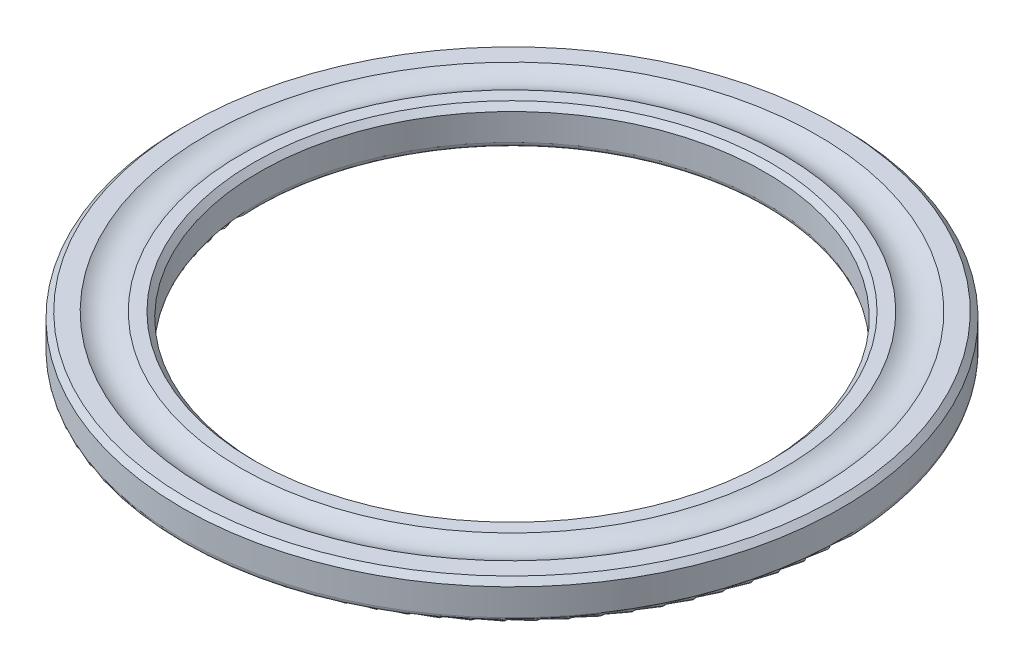
ISO-10303-21;
HEADER;
FILE_DESCRIPTION(('STEP AP214'),'2;1');
FILE_NAME('part.step','',(''),(''),'','','');
FILE_SCHEMA(('AUTOMOTIVE_DESIGN { 1 0 10303 214 1 1 1 1 }'));
ENDSEC;
DATA;
#1=APPLICATION_CONTEXT('core data for automotive mechanical design processes');
#2=APPLICATION_PROTOCOL_DEFINITION('international standard','automotive_design',2000,#1);
#3=PRODUCT_CONTEXT('',#1,'mechanical');
#4=PRODUCT('Part','Part','',(#3));
#5=PRODUCT_RELATED_PRODUCT_CATEGORY('part','',(#4));
#6=PRODUCT_DEFINITION_FORMATION('','',#4);
#7=PRODUCT_DEFINITION_CONTEXT('part definition',#1,'design');
#8=PRODUCT_DEFINITION('design','',#6,#7);
#9=PRODUCT_DEFINITION_SHAPE('','',#8);
#10=(LENGTH_UNIT() NAMED_UNIT(*) SI_UNIT(.MILLI.,.METRE.));
#11=(NAMED_UNIT(*) PLANE_ANGLE_UNIT() SI_UNIT($,.RADIAN.));
#12=(NAMED_UNIT(*) SI_UNIT($,.STERADIAN.) SOLID_ANGLE_UNIT());
#13=UNCERTAINTY_MEASURE_WITH_UNIT(LENGTH_MEASURE(1.E-05),#10,'distance_accuracy_value','');
#14=(GEOMETRIC_REPRESENTATION_CONTEXT(3) GLOBAL_UNCERTAINTY_ASSIGNED_CONTEXT((#13)) GLOBAL_UNIT_ASSIGNED_CONTEXT((#10,
#11,#12)) REPRESENTATION_CONTEXT('',''));
#15=CARTESIAN_POINT('',(0.,0.,0.));
#16=DIRECTION('',(0.,0.,1.));
#17=DIRECTION('',(1.,0.,0.));
#18=AXIS2_PLACEMENT_3D('',#15,#16,#17);
#19=CARTESIAN_POINT('',(0.,1.,0.));
#20=DIRECTION('',(0.,1.,0.));
#21=DIRECTION('',(0.,0.,1.));
#22=AXIS2_PLACEMENT_3D('',#19,#20,#21);
#23=TOROIDAL_SURFACE('',#22,59.,1.);
#24=CARTESIAN_POINT('',(0.,0.,0.));
#25=DIRECTION('',(0.,1.,0.));
#26=DIRECTION('',(0.,0.,1.));
#27=AXIS2_PLACEMENT_3D('',#24,#25,#26);
#28=CIRCLE('',#27,59.);
#29=CARTESIAN_POINT('',(0.,0.,59.));
#30=VERTEX_POINT('',#29);
#31=EDGE_CURVE('E10',#30,#30,#28,.T.);
#32=ORIENTED_EDGE('',*,*,#31,.T.);
#33=EDGE_LOOP('',(#32));
#34=FACE_BOUND('',#33,.T.);
#35=CARTESIAN_POINT('',(0.,1.,0.));
#36=DIRECTION('',(0.,1.,0.));
#37=DIRECTION('',(0.,0.,1.));
#38=AXIS2_PLACEMENT_3D('',#35,#36,#37);
#39=CIRCLE('',#38,60.);
#40=CARTESIAN_POINT('',(0.,1.,60.));
#41=VERTEX_POINT('',#40);
#42=EDGE_CURVE('E65',#41,#41,#39,.T.);
#43=ORIENTED_EDGE('',*,*,#42,.F.);
#44=EDGE_LOOP('',(#43));
#45=FACE_BOUND('',#44,.T.);
#46=ADVANCED_FACE('F31',(#34,#45),#23,.T.);
#47=CARTESIAN_POINT('',(59.,0.,0.));
#48=DIRECTION('',(0.,-1.,0.));
#49=DIRECTION('',(0.,0.,-1.));
#50=AXIS2_PLACEMENT_3D('',#47,#48,#49);
#51=PLANE('',#50);
#52=CARTESIAN_POINT('',(0.,0.,0.));
#53=DIRECTION('',(0.,1.,0.));
#54=DIRECTION('',(0.,0.,1.));
#55=AXIS2_PLACEMENT_3D('',#52,#53,#54);
#56=CIRCLE('',#55,47.);
#57=CARTESIAN_POINT('',(0.,0.,47.));
#58=VERTEX_POINT('',#57);
#59=EDGE_CURVE('E37',#58,#58,#56,.T.);
#60=ORIENTED_EDGE('',*,*,#59,.T.);
#61=EDGE_LOOP('',(#60));
#62=FACE_BOUND('',#61,.T.);
#63=ORIENTED_EDGE('',*,*,#31,.F.);
#64=EDGE_LOOP('',(#63));
#65=FACE_BOUND('',#64,.T.);
#66=ADVANCED_FACE('F73',(#62,#65),#51,.T.);
#67=CARTESIAN_POINT('',(0.,1.,0.));
#68=DIRECTION('',(0.,1.,0.));
#69=DIRECTION('',(0.,0.,1.));
#70=AXIS2_PLACEMENT_3D('',#67,#68,#69);
#71=TOROIDAL_SURFACE('',#70,47.,1.);
#72=CARTESIAN_POINT('',(0.,1.,0.));
#73=DIRECTION('',(0.,1.,0.));
#74=DIRECTION('',(0.,0.,1.));
#75=AXIS2_PLACEMENT_3D('',#72,#73,#74);
#76=CIRCLE('',#75,46.);
#77=CARTESIAN_POINT('',(0.,1.,46.));
#78=VERTEX_POINT('',#77);
#79=EDGE_CURVE('E41',#78,#78,#76,.T.);
#80=ORIENTED_EDGE('',*,*,#79,.T.);
#81=EDGE_LOOP('',(#80));
#82=FACE_BOUND('',#81,.T.);
#83=ORIENTED_EDGE('',*,*,#59,.F.);
#84=EDGE_LOOP('',(#83));
#85=FACE_BOUND('',#84,.T.);
#86=ADVANCED_FACE('F77',(#82,#85),#71,.T.);
#87=CARTESIAN_POINT('',(0.,0.,0.));
#88=DIRECTION('',(0.,1.,0.));
#89=DIRECTION('',(0.,0.,1.));
#90=AXIS2_PLACEMENT_3D('',#87,#88,#89);
#91=CYLINDRICAL_SURFACE('',#90,46.);
#92=CARTESIAN_POINT('',(0.,5.8724,0.));
#93=DIRECTION('',(0.,1.,0.));
#94=DIRECTION('',(0.,0.,1.));
#95=AXIS2_PLACEMENT_3D('',#92,#93,#94);
#96=CIRCLE('',#95,46.);
#97=CARTESIAN_POINT('',(0.,5.8724,46.));
#98=VERTEX_POINT('',#97);
#99=EDGE_CURVE('E45',#98,#98,#96,.T.);
#100=ORIENTED_EDGE('',*,*,#99,.T.);
#101=EDGE_LOOP('',(#100));
#102=FACE_BOUND('',#101,.T.);
#103=ORIENTED_EDGE('',*,*,#79,.F.);
#104=EDGE_LOOP('',(#103));
#105=FACE_BOUND('',#104,.T.);
#106=ADVANCED_FACE('F81',(#102,#105),#91,.F.);
#107=CARTESIAN_POINT('',(0.,5.8724,0.));
#108=DIRECTION('',(0.,1.,0.));
#109=DIRECTION('',(0.,0.,1.));
#110=AXIS2_PLACEMENT_3D('',#107,#108,#109);
#111=CONICAL_SURFACE('',#110,46.,0.785398163397353);
#112=CARTESIAN_POINT('',(0.,6.87240000000019,0.));
#113=DIRECTION('',(0.,1.,0.));
#114=DIRECTION('',(0.,0.,1.));
#115=AXIS2_PLACEMENT_3D('',#112,#113,#114);
#116=CIRCLE('',#115,47.);
#117=CARTESIAN_POINT('',(0.,6.87240000000019,47.));
#118=VERTEX_POINT('',#117);
#119=EDGE_CURVE('E50',#118,#118,#116,.T.);
#120=ORIENTED_EDGE('',*,*,#119,.T.);
#121=EDGE_LOOP('',(#120));
#122=FACE_BOUND('',#121,.T.);
#123=ORIENTED_EDGE('',*,*,#99,.F.);
#124=EDGE_LOOP('',(#123));
#125=FACE_BOUND('',#124,.T.);
#126=ADVANCED_FACE('F88',(#122,#125),#111,.F.);
#127=CARTESIAN_POINT('',(47.,6.87240000000009,0.));
#128=DIRECTION('',(0.,1.,0.));
#129=DIRECTION('',(0.,0.,1.));
#130=AXIS2_PLACEMENT_3D('',#127,#128,#129);
#131=PLANE('',#130);
#132=CARTESIAN_POINT('',(0.,6.8724,0.));
#133=DIRECTION('',(0.,1.,0.));
#134=DIRECTION('',(0.,0.,1.));
#135=AXIS2_PLACEMENT_3D('',#132,#133,#134);
#136=CIRCLE('',#135,49.4043);
#137=CARTESIAN_POINT('',(0.,6.8724,49.4043));
#138=VERTEX_POINT('',#137);
#139=EDGE_CURVE('E53',#138,#138,#136,.T.);
#140=ORIENTED_EDGE('',*,*,#139,.T.);
#141=EDGE_LOOP('',(#140));
#142=FACE_BOUND('',#141,.T.);
#143=ORIENTED_EDGE('',*,*,#119,.F.);
#144=EDGE_LOOP('',(#143));
#145=FACE_BOUND('',#144,.T.);
#146=ADVANCED_FACE('F92',(#142,#145),#131,.T.);
#147=CARTESIAN_POINT('',(0.,11.,0.));
#148=DIRECTION('',(0.,1.,0.));
#149=DIRECTION('',(0.,0.,1.));
#150=AXIS2_PLACEMENT_3D('',#147,#148,#149);
#151=TOROIDAL_SURFACE('',#150,52.5,5.15950000000006);
#152=CARTESIAN_POINT('',(0.,6.87239999999989,0.));
#153=DIRECTION('',(0.,1.,0.));
#154=DIRECTION('',(0.,0.,1.));
#155=AXIS2_PLACEMENT_3D('',#152,#153,#154);
#156=CIRCLE('',#155,55.5957);
#157=CARTESIAN_POINT('',(0.,6.87239999999989,55.5957));
#158=VERTEX_POINT('',#157);
#159=EDGE_CURVE('E56',#158,#158,#156,.T.);
#160=ORIENTED_EDGE('',*,*,#159,.T.);
#161=EDGE_LOOP('',(#160));
#162=FACE_BOUND('',#161,.T.);
#163=ORIENTED_EDGE('',*,*,#139,.F.);
#164=EDGE_LOOP('',(#163));
#165=FACE_BOUND('',#164,.T.);
#166=ADVANCED_FACE('F96',(#162,#165),#151,.F.);
#167=CARTESIAN_POINT('',(55.5957,6.87239999999995,0.));
#168=DIRECTION('',(0.,1.,0.));
#169=DIRECTION('',(0.,0.,1.));
#170=AXIS2_PLACEMENT_3D('',#167,#168,#169);
#171=PLANE('',#170);
#172=CARTESIAN_POINT('',(0.,6.8724,0.));
#173=DIRECTION('',(0.,1.,0.));
#174=DIRECTION('',(0.,0.,1.));
#175=AXIS2_PLACEMENT_3D('',#172,#173,#174);
#176=CIRCLE('',#175,59.);
#177=CARTESIAN_POINT('',(0.,6.8724,59.));
#178=VERTEX_POINT('',#177);
#179=EDGE_CURVE('E59',#178,#178,#176,.T.);
#180=ORIENTED_EDGE('',*,*,#179,.T.);
#181=EDGE_LOOP('',(#180));
#182=FACE_BOUND('',#181,.T.);
#183=ORIENTED_EDGE('',*,*,#159,.F.);
#184=EDGE_LOOP('',(#183));
#185=FACE_BOUND('',#184,.T.);
#186=ADVANCED_FACE('F100',(#182,#185),#171,.T.);
#187=CARTESIAN_POINT('',(0.,6.8724,0.));
#188=DIRECTION('',(0.,-1.,0.));
#189=DIRECTION('',(0.,0.,-1.));
#190=AXIS2_PLACEMENT_3D('',#187,#188,#189);
#191=CONICAL_SURFACE('',#190,59.,0.785398163397448);
#192=CARTESIAN_POINT('',(0.,5.8724,0.));
#193=DIRECTION('',(0.,1.,0.));
#194=DIRECTION('',(0.,0.,1.));
#195=AXIS2_PLACEMENT_3D('',#192,#193,#194);
#196=CIRCLE('',#195,60.);
#197=CARTESIAN_POINT('',(0.,5.8724,60.));
#198=VERTEX_POINT('',#197);
#199=EDGE_CURVE('E62',#198,#198,#196,.T.);
#200=ORIENTED_EDGE('',*,*,#199,.T.);
#201=EDGE_LOOP('',(#200));
#202=FACE_BOUND('',#201,.T.);
#203=ORIENTED_EDGE('',*,*,#179,.F.);
#204=EDGE_LOOP('',(#203));
#205=FACE_BOUND('',#204,.T.);
#206=ADVANCED_FACE('F104',(#202,#205),#191,.T.);
#207=CARTESIAN_POINT('',(0.,0.,0.));
#208=DIRECTION('',(0.,1.,0.));
#209=DIRECTION('',(0.,0.,1.));
#210=AXIS2_PLACEMENT_3D('',#207,#208,#209);
#211=CYLINDRICAL_SURFACE('',#210,60.);
#212=ORIENTED_EDGE('',*,*,#42,.T.);
#213=EDGE_LOOP('',(#212));
#214=FACE_BOUND('',#213,.T.);
#215=ORIENTED_EDGE('',*,*,#199,.F.);
#216=EDGE_LOOP('',(#215));
#217=FACE_BOUND('',#216,.T.);
#218=ADVANCED_FACE('F69',(#214,#217),#211,.T.);
#219=CLOSED_SHELL('',(#46,#66,#86,#106,#126,#146,#166,#186,#206,#218));
#220=MANIFOLD_SOLID_BREP('B2',#219);
#221=ADVANCED_BREP_SHAPE_REPRESENTATION('',(#18,#220),#14);
#222=SHAPE_DEFINITION_REPRESENTATION(#9,#221);
ENDSEC;
END-ISO-10303-21;
